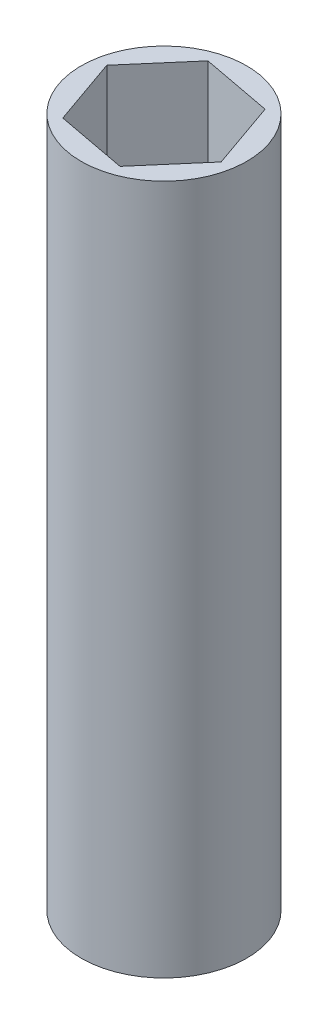
ISO-10303-21;
HEADER;
FILE_DESCRIPTION(('STEP AP214'),'2;1');
FILE_NAME('part.step','',(''),(''),'','','');
FILE_SCHEMA(('AUTOMOTIVE_DESIGN { 1 0 10303 214 1 1 1 1 }'));
ENDSEC;
DATA;
#1=APPLICATION_CONTEXT('core data for automotive mechanical design processes');
#2=APPLICATION_PROTOCOL_DEFINITION('international standard','automotive_design',2000,#1);
#3=PRODUCT_CONTEXT('',#1,'mechanical');
#4=PRODUCT('Part','Part','',(#3));
#5=PRODUCT_RELATED_PRODUCT_CATEGORY('part','',(#4));
#6=PRODUCT_DEFINITION_FORMATION('','',#4);
#7=PRODUCT_DEFINITION_CONTEXT('part definition',#1,'design');
#8=PRODUCT_DEFINITION('design','',#6,#7);
#9=PRODUCT_DEFINITION_SHAPE('','',#8);
#10=(LENGTH_UNIT() NAMED_UNIT(*) SI_UNIT(.MILLI.,.METRE.));
#11=(NAMED_UNIT(*) PLANE_ANGLE_UNIT() SI_UNIT($,.RADIAN.));
#12=(NAMED_UNIT(*) SI_UNIT($,.STERADIAN.) SOLID_ANGLE_UNIT());
#13=UNCERTAINTY_MEASURE_WITH_UNIT(LENGTH_MEASURE(1.E-05),#10,'distance_accuracy_value','');
#14=(GEOMETRIC_REPRESENTATION_CONTEXT(3) GLOBAL_UNCERTAINTY_ASSIGNED_CONTEXT((#13)) GLOBAL_UNIT_ASSIGNED_CONTEXT((#10,
#11,#12)) REPRESENTATION_CONTEXT('',''));
#15=CARTESIAN_POINT('',(0.,0.,0.));
#16=DIRECTION('',(0.,0.,1.));
#17=DIRECTION('',(1.,0.,0.));
#18=AXIS2_PLACEMENT_3D('',#15,#16,#17);
#19=CARTESIAN_POINT('',(0.,250.,0.));
#20=DIRECTION('',(0.,-1.,0.));
#21=DIRECTION('',(0.,0.,-1.));
#22=AXIS2_PLACEMENT_3D('',#19,#20,#21);
#23=CYLINDRICAL_SURFACE('',#22,30.);
#24=CARTESIAN_POINT('',(0.,250.,0.));
#25=DIRECTION('',(0.,1.,0.));
#26=DIRECTION('',(0.,0.,1.));
#27=AXIS2_PLACEMENT_3D('',#24,#25,#26);
#28=CIRCLE('',#27,30.);
#29=CARTESIAN_POINT('',(0.,250.,30.));
#30=VERTEX_POINT('',#29);
#31=EDGE_CURVE('E11',#30,#30,#28,.T.);
#32=ORIENTED_EDGE('',*,*,#31,.F.);
#33=EDGE_LOOP('',(#32));
#34=FACE_BOUND('',#33,.T.);
#35=CARTESIAN_POINT('',(0.,0.,0.));
#36=DIRECTION('',(0.,1.,0.));
#37=DIRECTION('',(0.,0.,1.));
#38=AXIS2_PLACEMENT_3D('',#35,#36,#37);
#39=CIRCLE('',#38,30.);
#40=CARTESIAN_POINT('',(0.,0.,30.));
#41=VERTEX_POINT('',#40);
#42=EDGE_CURVE('E42',#41,#41,#39,.T.);
#43=ORIENTED_EDGE('',*,*,#42,.T.);
#44=EDGE_LOOP('',(#43));
#45=FACE_BOUND('',#44,.T.);
#46=ADVANCED_FACE('F39',(#34,#45),#23,.T.);
#47=CARTESIAN_POINT('',(0.,250.,0.));
#48=DIRECTION('',(0.,1.,0.));
#49=DIRECTION('',(0.,0.,1.));
#50=AXIS2_PLACEMENT_3D('',#47,#48,#49);
#51=PLANE('',#50);
#52=DIRECTION('',(0.651725152858325,0.,-0.758455222891763));
#53=VECTOR('',#52,1.);
#54=CARTESIAN_POINT('',(8.59908443515559,250.,24.5164382991711));
#55=LINE('',#54,#53);
#56=CARTESIAN_POINT('',(8.59908443515559,250.,24.5164382991711));
#57=VERTEX_POINT('',#56);
#58=CARTESIAN_POINT('',(25.5314005949738,250.,4.81119357945349));
#59=VERTEX_POINT('',#58);
#60=EDGE_CURVE('E54',#57,#59,#55,.T.);
#61=ORIENTED_EDGE('',*,*,#60,.F.);
#62=DIRECTION('',(0.982704067086417,0.,0.185182927214724));
#63=VECTOR('',#62,1.);
#64=CARTESIAN_POINT('',(-16.9323161598182,250.,19.7052447197177));
#65=LINE('',#64,#63);
#66=CARTESIAN_POINT('',(-16.9323161598182,250.,19.7052447197177));
#67=VERTEX_POINT('',#66);
#68=EDGE_CURVE('E114',#67,#57,#65,.T.);
#69=ORIENTED_EDGE('',*,*,#68,.F.);
#70=DIRECTION('',(0.330978914228093,0.,0.943638150106487));
#71=VECTOR('',#70,1.);
#72=CARTESIAN_POINT('',(-25.5314005949737,250.,-4.81119357945348));
#73=LINE('',#72,#71);
#74=CARTESIAN_POINT('',(-25.5314005949737,250.,-4.81119357945348));
#75=VERTEX_POINT('',#74);
#76=EDGE_CURVE('E118',#75,#67,#73,.T.);
#77=ORIENTED_EDGE('',*,*,#76,.F.);
#78=DIRECTION('',(-0.651725152858325,0.,0.758455222891762));
#79=VECTOR('',#78,1.);
#80=CARTESIAN_POINT('',(-8.59908443515557,250.,-24.5164382991711));
#81=LINE('',#80,#79);
#82=CARTESIAN_POINT('',(-8.59908443515557,250.,-24.5164382991711));
#83=VERTEX_POINT('',#82);
#84=EDGE_CURVE('E141',#83,#75,#81,.T.);
#85=ORIENTED_EDGE('',*,*,#84,.F.);
#86=DIRECTION('',(-0.982704067086418,0.,-0.185182927214724));
#87=VECTOR('',#86,1.);
#88=CARTESIAN_POINT('',(16.9323161598182,250.,-19.7052447197177));
#89=LINE('',#88,#87);
#90=CARTESIAN_POINT('',(16.9323161598182,250.,-19.7052447197177));
#91=VERTEX_POINT('',#90);
#92=EDGE_CURVE('E137',#91,#83,#89,.T.);
#93=ORIENTED_EDGE('',*,*,#92,.F.);
#94=DIRECTION('',(-0.330978914228093,0.,-0.943638150106487));
#95=VECTOR('',#94,1.);
#96=CARTESIAN_POINT('',(25.5314005949738,250.,4.81119357945349));
#97=LINE('',#96,#95);
#98=EDGE_CURVE('E134',#59,#91,#97,.T.);
#99=ORIENTED_EDGE('',*,*,#98,.F.);
#100=EDGE_LOOP('',(#61,#69,#77,#85,#93,#99));
#101=FACE_BOUND('',#100,.T.);
#102=ORIENTED_EDGE('',*,*,#31,.T.);
#103=EDGE_LOOP('',(#102));
#104=FACE_BOUND('',#103,.T.);
#105=ADVANCED_FACE('F165',(#101,#104),#51,.T.);
#106=CARTESIAN_POINT('',(0.,0.,0.));
#107=DIRECTION('',(0.,1.,0.));
#108=DIRECTION('',(0.,0.,1.));
#109=AXIS2_PLACEMENT_3D('',#106,#107,#108);
#110=PLANE('',#109);
#111=DIRECTION('',(0.982704067086417,0.,0.185182927214724));
#112=VECTOR('',#111,1.);
#113=CARTESIAN_POINT('',(-16.9323161598182,0.,19.7052447197177));
#114=LINE('',#113,#112);
#115=CARTESIAN_POINT('',(-16.9323161598182,0.,19.7052447197177));
#116=VERTEX_POINT('',#115);
#117=CARTESIAN_POINT('',(8.59908443515559,0.,24.5164382991711));
#118=VERTEX_POINT('',#117);
#119=EDGE_CURVE('E101',#116,#118,#114,.T.);
#120=ORIENTED_EDGE('',*,*,#119,.T.);
#121=DIRECTION('',(0.651725152858325,0.,-0.758455222891763));
#122=VECTOR('',#121,1.);
#123=CARTESIAN_POINT('',(8.59908443515559,0.,24.5164382991711));
#124=LINE('',#123,#122);
#125=CARTESIAN_POINT('',(25.5314005949738,0.,4.81119357945349));
#126=VERTEX_POINT('',#125);
#127=EDGE_CURVE('E94',#118,#126,#124,.T.);
#128=ORIENTED_EDGE('',*,*,#127,.T.);
#129=DIRECTION('',(-0.330978914228093,0.,-0.943638150106487));
#130=VECTOR('',#129,1.);
#131=CARTESIAN_POINT('',(25.5314005949738,0.,4.81119357945349));
#132=LINE('',#131,#130);
#133=CARTESIAN_POINT('',(16.9323161598182,0.,-19.7052447197177));
#134=VERTEX_POINT('',#133);
#135=EDGE_CURVE('E104',#126,#134,#132,.T.);
#136=ORIENTED_EDGE('',*,*,#135,.T.);
#137=DIRECTION('',(-0.982704067086418,0.,-0.185182927214724));
#138=VECTOR('',#137,1.);
#139=CARTESIAN_POINT('',(16.9323161598182,0.,-19.7052447197177));
#140=LINE('',#139,#138);
#141=CARTESIAN_POINT('',(-8.59908443515557,0.,-24.5164382991711));
#142=VERTEX_POINT('',#141);
#143=EDGE_CURVE('E62',#134,#142,#140,.T.);
#144=ORIENTED_EDGE('',*,*,#143,.T.);
#145=DIRECTION('',(-0.651725152858325,0.,0.758455222891762));
#146=VECTOR('',#145,1.);
#147=CARTESIAN_POINT('',(-8.59908443515557,0.,-24.5164382991711));
#148=LINE('',#147,#146);
#149=CARTESIAN_POINT('',(-25.5314005949737,0.,-4.81119357945348));
#150=VERTEX_POINT('',#149);
#151=EDGE_CURVE('E123',#142,#150,#148,.T.);
#152=ORIENTED_EDGE('',*,*,#151,.T.);
#153=DIRECTION('',(0.330978914228093,0.,0.943638150106487));
#154=VECTOR('',#153,1.);
#155=CARTESIAN_POINT('',(-25.5314005949737,0.,-4.81119357945348));
#156=LINE('',#155,#154);
#157=EDGE_CURVE('E127',#150,#116,#156,.T.);
#158=ORIENTED_EDGE('',*,*,#157,.T.);
#159=EDGE_LOOP('',(#120,#128,#136,#144,#152,#158));
#160=FACE_BOUND('',#159,.T.);
#161=ORIENTED_EDGE('',*,*,#42,.F.);
#162=EDGE_LOOP('',(#161));
#163=FACE_BOUND('',#162,.T.);
#164=ADVANCED_FACE('F109',(#160,#163),#110,.F.);
#165=CARTESIAN_POINT('',(8.59908443515559,0.,24.5164382991711));
#166=DIRECTION('',(0.758455222891763,0.,0.651725152858325));
#167=DIRECTION('',(0.651725152858325,0.,-0.758455222891763));
#168=AXIS2_PLACEMENT_3D('',#165,#166,#167);
#169=PLANE('',#168);
#170=ORIENTED_EDGE('',*,*,#60,.T.);
#171=DIRECTION('',(0.,1.,0.));
#172=VECTOR('',#171,1.);
#173=CARTESIAN_POINT('',(25.5314005949738,0.,4.81119357945349));
#174=LINE('',#173,#172);
#175=EDGE_CURVE('E90',#126,#59,#174,.T.);
#176=ORIENTED_EDGE('',*,*,#175,.F.);
#177=ORIENTED_EDGE('',*,*,#127,.F.);
#178=DIRECTION('',(0.,1.,0.));
#179=VECTOR('',#178,1.);
#180=CARTESIAN_POINT('',(8.59908443515559,0.,24.5164382991711));
#181=LINE('',#180,#179);
#182=EDGE_CURVE('E148',#118,#57,#181,.T.);
#183=ORIENTED_EDGE('',*,*,#182,.T.);
#184=EDGE_LOOP('',(#170,#176,#177,#183));
#185=FACE_BOUND('',#184,.T.);
#186=ADVANCED_FACE('F92',(#185),#169,.F.);
#187=CARTESIAN_POINT('',(-16.9323161598182,0.,19.7052447197177));
#188=DIRECTION('',(-0.185182927214724,0.,0.982704067086418));
#189=DIRECTION('',(0.982704067086417,0.,0.185182927214724));
#190=AXIS2_PLACEMENT_3D('',#187,#188,#189);
#191=PLANE('',#190);
#192=ORIENTED_EDGE('',*,*,#68,.T.);
#193=ORIENTED_EDGE('',*,*,#182,.F.);
#194=ORIENTED_EDGE('',*,*,#119,.F.);
#195=DIRECTION('',(0.,1.,0.));
#196=VECTOR('',#195,1.);
#197=CARTESIAN_POINT('',(-16.9323161598182,0.,19.7052447197177));
#198=LINE('',#197,#196);
#199=EDGE_CURVE('E151',#116,#67,#198,.T.);
#200=ORIENTED_EDGE('',*,*,#199,.T.);
#201=EDGE_LOOP('',(#192,#193,#194,#200));
#202=FACE_BOUND('',#201,.T.);
#203=ADVANCED_FACE('F176',(#202),#191,.F.);
#204=CARTESIAN_POINT('',(-25.5314005949737,0.,-4.81119357945348));
#205=DIRECTION('',(-0.943638150106487,0.,0.330978914228093));
#206=DIRECTION('',(0.330978914228093,0.,0.943638150106487));
#207=AXIS2_PLACEMENT_3D('',#204,#205,#206);
#208=PLANE('',#207);
#209=ORIENTED_EDGE('',*,*,#76,.T.);
#210=ORIENTED_EDGE('',*,*,#199,.F.);
#211=ORIENTED_EDGE('',*,*,#157,.F.);
#212=DIRECTION('',(0.,1.,0.));
#213=VECTOR('',#212,1.);
#214=CARTESIAN_POINT('',(-25.5314005949737,0.,-4.81119357945348));
#215=LINE('',#214,#213);
#216=EDGE_CURVE('E154',#150,#75,#215,.T.);
#217=ORIENTED_EDGE('',*,*,#216,.T.);
#218=EDGE_LOOP('',(#209,#210,#211,#217));
#219=FACE_BOUND('',#218,.T.);
#220=ADVANCED_FACE('F174',(#219),#208,.F.);
#221=CARTESIAN_POINT('',(-8.59908443515557,0.,-24.5164382991711));
#222=DIRECTION('',(-0.758455222891763,0.,-0.651725152858325));
#223=DIRECTION('',(-0.651725152858325,0.,0.758455222891762));
#224=AXIS2_PLACEMENT_3D('',#221,#222,#223);
#225=PLANE('',#224);
#226=ORIENTED_EDGE('',*,*,#84,.T.);
#227=ORIENTED_EDGE('',*,*,#216,.F.);
#228=ORIENTED_EDGE('',*,*,#151,.F.);
#229=DIRECTION('',(0.,1.,0.));
#230=VECTOR('',#229,1.);
#231=CARTESIAN_POINT('',(-8.59908443515557,0.,-24.5164382991711));
#232=LINE('',#231,#230);
#233=EDGE_CURVE('E157',#142,#83,#232,.T.);
#234=ORIENTED_EDGE('',*,*,#233,.T.);
#235=EDGE_LOOP('',(#226,#227,#228,#234));
#236=FACE_BOUND('',#235,.T.);
#237=ADVANCED_FACE('F170',(#236),#225,.F.);
#238=CARTESIAN_POINT('',(16.9323161598182,0.,-19.7052447197177));
#239=DIRECTION('',(0.185182927214724,0.,-0.982704067086418));
#240=DIRECTION('',(-0.982704067086418,0.,-0.185182927214724));
#241=AXIS2_PLACEMENT_3D('',#238,#239,#240);
#242=PLANE('',#241);
#243=ORIENTED_EDGE('',*,*,#92,.T.);
#244=ORIENTED_EDGE('',*,*,#233,.F.);
#245=ORIENTED_EDGE('',*,*,#143,.F.);
#246=DIRECTION('',(0.,1.,0.));
#247=VECTOR('',#246,1.);
#248=CARTESIAN_POINT('',(16.9323161598182,0.,-19.7052447197177));
#249=LINE('',#248,#247);
#250=EDGE_CURVE('E100',#134,#91,#249,.T.);
#251=ORIENTED_EDGE('',*,*,#250,.T.);
#252=EDGE_LOOP('',(#243,#244,#245,#251));
#253=FACE_BOUND('',#252,.T.);
#254=ADVANCED_FACE('F161',(#253),#242,.F.);
#255=CARTESIAN_POINT('',(25.5314005949738,0.,4.81119357945349));
#256=DIRECTION('',(0.943638150106487,0.,-0.330978914228093));
#257=DIRECTION('',(-0.330978914228093,0.,-0.943638150106487));
#258=AXIS2_PLACEMENT_3D('',#255,#256,#257);
#259=PLANE('',#258);
#260=ORIENTED_EDGE('',*,*,#98,.T.);
#261=ORIENTED_EDGE('',*,*,#250,.F.);
#262=ORIENTED_EDGE('',*,*,#135,.F.);
#263=ORIENTED_EDGE('',*,*,#175,.T.);
#264=EDGE_LOOP('',(#260,#261,#262,#263));
#265=FACE_BOUND('',#264,.T.);
#266=ADVANCED_FACE('F105',(#265),#259,.F.);
#267=CLOSED_SHELL('',(#46,#105,#164,#186,#203,#220,#237,#254,#266));
#268=MANIFOLD_SOLID_BREP('B2',#267);
#269=ADVANCED_BREP_SHAPE_REPRESENTATION('',(#18,#268),#14);
#270=SHAPE_DEFINITION_REPRESENTATION(#9,#269);
ENDSEC;
END-ISO-10303-21;
